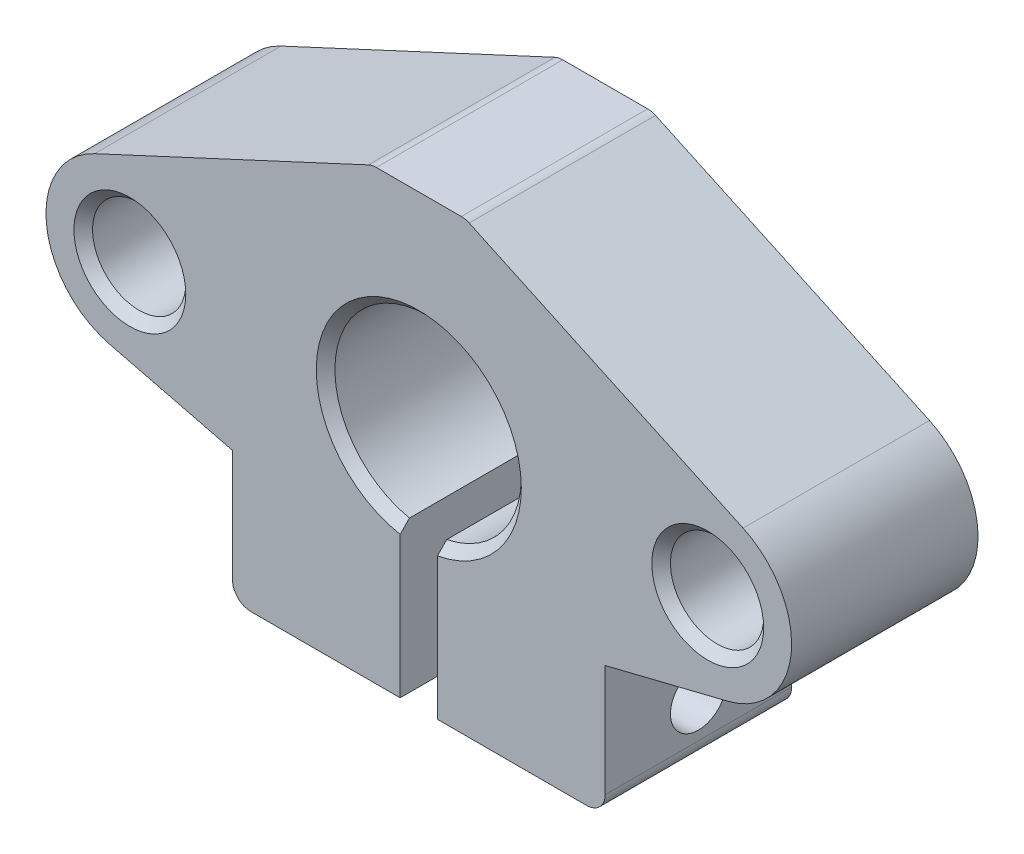
ISO-10303-21;
HEADER;
FILE_DESCRIPTION(('STEP AP214'),'2;1');
FILE_NAME('part.step','',(''),(''),'','','');
FILE_SCHEMA(('AUTOMOTIVE_DESIGN { 1 0 10303 214 1 1 1 1 }'));
ENDSEC;
DATA;
#1=APPLICATION_CONTEXT('core data for automotive mechanical design processes');
#2=APPLICATION_PROTOCOL_DEFINITION('international standard','automotive_design',2000,#1);
#3=PRODUCT_CONTEXT('',#1,'mechanical');
#4=PRODUCT('Part','Part','',(#3));
#5=PRODUCT_RELATED_PRODUCT_CATEGORY('part','',(#4));
#6=PRODUCT_DEFINITION_FORMATION('','',#4);
#7=PRODUCT_DEFINITION_CONTEXT('part definition',#1,'design');
#8=PRODUCT_DEFINITION('design','',#6,#7);
#9=PRODUCT_DEFINITION_SHAPE('','',#8);
#10=(LENGTH_UNIT() NAMED_UNIT(*) SI_UNIT(.MILLI.,.METRE.));
#11=(NAMED_UNIT(*) PLANE_ANGLE_UNIT() SI_UNIT($,.RADIAN.));
#12=(NAMED_UNIT(*) SI_UNIT($,.STERADIAN.) SOLID_ANGLE_UNIT());
#13=UNCERTAINTY_MEASURE_WITH_UNIT(LENGTH_MEASURE(1.E-05),#10,'distance_accuracy_value','');
#14=(GEOMETRIC_REPRESENTATION_CONTEXT(3) GLOBAL_UNCERTAINTY_ASSIGNED_CONTEXT((#13)) GLOBAL_UNIT_ASSIGNED_CONTEXT((#10,
#11,#12)) REPRESENTATION_CONTEXT('',''));
#15=CARTESIAN_POINT('',(0.,0.,0.));
#16=DIRECTION('',(0.,0.,1.));
#17=DIRECTION('',(1.,0.,0.));
#18=AXIS2_PLACEMENT_3D('',#15,#16,#17);
#19=CARTESIAN_POINT('',(-10.,0.,10.));
#20=DIRECTION('',(0.,1.,0.));
#21=DIRECTION('',(0.,0.,1.));
#22=AXIS2_PLACEMENT_3D('',#19,#20,#21);
#23=PLANE('',#22);
#24=DIRECTION('',(1.,0.,0.));
#25=VECTOR('',#24,1.);
#26=CARTESIAN_POINT('',(-10.,0.,10.));
#27=LINE('',#26,#25);
#28=CARTESIAN_POINT('',(-9.,0.,10.));
#29=VERTEX_POINT('',#28);
#30=CARTESIAN_POINT('',(-1.,0.,10.));
#31=VERTEX_POINT('',#30);
#32=EDGE_CURVE('E254',#29,#31,#27,.T.);
#33=ORIENTED_EDGE('',*,*,#32,.F.);
#34=DIRECTION('',(0.,0.,-1.));
#35=VECTOR('',#34,1.);
#36=CARTESIAN_POINT('',(-9.,0.,10.));
#37=LINE('',#36,#35);
#38=CARTESIAN_POINT('',(-9.,0.,0.));
#39=VERTEX_POINT('',#38);
#40=EDGE_CURVE('E195',#29,#39,#37,.T.);
#41=ORIENTED_EDGE('',*,*,#40,.T.);
#42=DIRECTION('',(1.,0.,0.));
#43=VECTOR('',#42,1.);
#44=CARTESIAN_POINT('',(-10.,0.,0.));
#45=LINE('',#44,#43);
#46=CARTESIAN_POINT('',(-1.,0.,0.));
#47=VERTEX_POINT('',#46);
#48=EDGE_CURVE('E190',#39,#47,#45,.T.);
#49=ORIENTED_EDGE('',*,*,#48,.T.);
#50=DIRECTION('',(0.,0.,-1.));
#51=VECTOR('',#50,1.);
#52=CARTESIAN_POINT('',(-1.,0.,10.));
#53=LINE('',#52,#51);
#54=EDGE_CURVE('E186',#31,#47,#53,.T.);
#55=ORIENTED_EDGE('',*,*,#54,.F.);
#56=EDGE_LOOP('',(#33,#41,#49,#55));
#57=FACE_BOUND('',#56,.T.);
#58=ADVANCED_FACE('F44',(#57),#23,.F.);
#59=CARTESIAN_POINT('',(1.,0.,0.));
#60=VERTEX_POINT('',#59);
#61=CARTESIAN_POINT('',(9.,0.,0.));
#62=VERTEX_POINT('',#61);
#63=EDGE_CURVE('E192',#60,#62,#45,.T.);
#64=ORIENTED_EDGE('',*,*,#63,.T.);
#65=DIRECTION('',(0.,0.,-1.));
#66=VECTOR('',#65,1.);
#67=CARTESIAN_POINT('',(9.,0.,10.));
#68=LINE('',#67,#66);
#69=CARTESIAN_POINT('',(9.,0.,10.));
#70=VERTEX_POINT('',#69);
#71=EDGE_CURVE('E11',#62,#70,#68,.F.);
#72=ORIENTED_EDGE('',*,*,#71,.T.);
#73=CARTESIAN_POINT('',(0.999999999999999,0.,10.));
#74=VERTEX_POINT('',#73);
#75=EDGE_CURVE('E256',#74,#70,#27,.T.);
#76=ORIENTED_EDGE('',*,*,#75,.F.);
#77=DIRECTION('',(0.,0.,1.));
#78=VECTOR('',#77,1.);
#79=CARTESIAN_POINT('',(0.999999999999999,0.,10.));
#80=LINE('',#79,#78);
#81=EDGE_CURVE('E210',#60,#74,#80,.T.);
#82=ORIENTED_EDGE('',*,*,#81,.F.);
#83=EDGE_LOOP('',(#64,#72,#76,#82));
#84=FACE_BOUND('',#83,.T.);
#85=ADVANCED_FACE('F409',(#84),#23,.F.);
#86=CARTESIAN_POINT('',(0.,13.,10.));
#87=DIRECTION('',(0.,0.,1.));
#88=DIRECTION('',(1.,0.,0.));
#89=AXIS2_PLACEMENT_3D('',#86,#87,#88);
#90=PLANE('',#89);
#91=CARTESIAN_POINT('',(15.5,13.,10.));
#92=DIRECTION('',(0.,0.,1.));
#93=DIRECTION('',(1.,0.,0.));
#94=AXIS2_PLACEMENT_3D('',#91,#92,#93);
#95=CIRCLE('',#94,3.00000000000001);
#96=CARTESIAN_POINT('',(18.5,13.,10.));
#97=VERTEX_POINT('',#96);
#98=EDGE_CURVE('E503',#97,#97,#95,.F.);
#99=ORIENTED_EDGE('',*,*,#98,.T.);
#100=EDGE_LOOP('',(#99));
#101=FACE_BOUND('',#100,.T.);
#102=CARTESIAN_POINT('',(-15.5,13.,10.));
#103=DIRECTION('',(0.,0.,1.));
#104=DIRECTION('',(1.,0.,0.));
#105=AXIS2_PLACEMENT_3D('',#102,#103,#104);
#106=CIRCLE('',#105,3.);
#107=CARTESIAN_POINT('',(-12.5,13.,10.));
#108=VERTEX_POINT('',#107);
#109=EDGE_CURVE('E508',#108,#108,#106,.F.);
#110=ORIENTED_EDGE('',*,*,#109,.T.);
#111=EDGE_LOOP('',(#110));
#112=FACE_BOUND('',#111,.T.);
#113=DIRECTION('',(-1.,0.,0.));
#114=VECTOR('',#113,1.);
#115=CARTESIAN_POINT('',(0.,24.,10.));
#116=LINE('',#115,#114);
#117=CARTESIAN_POINT('',(2.27909240608666,24.,10.));
#118=VERTEX_POINT('',#117);
#119=CARTESIAN_POINT('',(-2.27909240608666,24.,10.));
#120=VERTEX_POINT('',#119);
#121=EDGE_CURVE('E260',#118,#120,#116,.T.);
#122=ORIENTED_EDGE('',*,*,#121,.T.);
#123=CARTESIAN_POINT('',(-2.27909240608666,23.,10.));
#124=DIRECTION('',(0.,0.,1.));
#125=DIRECTION('',(1.,0.,0.));
#126=AXIS2_PLACEMENT_3D('',#123,#124,#125);
#127=CIRCLE('',#126,1.);
#128=CARTESIAN_POINT('',(-2.70035014664606,23.9069409661157,10.));
#129=VERTEX_POINT('',#128);
#130=EDGE_CURVE('E480',#120,#129,#127,.T.);
#131=ORIENTED_EDGE('',*,*,#130,.T.);
#132=DIRECTION('',(-0.906940966115651,-0.421257740559398,0.));
#133=VECTOR('',#132,1.);
#134=CARTESIAN_POINT('',(-2.5,24.,10.));
#135=LINE('',#134,#133);
#136=CARTESIAN_POINT('',(-17.3956598325173,17.0812343475204,10.));
#137=VERTEX_POINT('',#136);
#138=EDGE_CURVE('E261',#129,#137,#135,.T.);
#139=ORIENTED_EDGE('',*,*,#138,.T.);
#140=CARTESIAN_POINT('',(-15.5,13.,10.));
#141=DIRECTION('',(0.,0.,1.));
#142=DIRECTION('',(1.,0.,0.));
#143=AXIS2_PLACEMENT_3D('',#140,#141,#142);
#144=CIRCLE('',#143,4.5);
#145=CARTESIAN_POINT('',(-16.5829873138775,8.63226162894565,10.));
#146=VERTEX_POINT('',#145);
#147=EDGE_CURVE('E263',#137,#146,#144,.T.);
#148=ORIENTED_EDGE('',*,*,#147,.T.);
#149=DIRECTION('',(0.970608526900966,-0.240663847528326,0.));
#150=VECTOR('',#149,1.);
#151=CARTESIAN_POINT('',(-16.5829873138775,8.63226162894565,10.));
#152=LINE('',#151,#150);
#153=CARTESIAN_POINT('',(-10.,7.,10.));
#154=VERTEX_POINT('',#153);
#155=EDGE_CURVE('E264',#146,#154,#152,.T.);
#156=ORIENTED_EDGE('',*,*,#155,.T.);
#157=DIRECTION('',(0.,-1.,0.));
#158=VECTOR('',#157,1.);
#159=CARTESIAN_POINT('',(-10.,7.,10.));
#160=LINE('',#159,#158);
#161=CARTESIAN_POINT('',(-10.,1.,10.));
#162=VERTEX_POINT('',#161);
#163=EDGE_CURVE('E270',#154,#162,#160,.T.);
#164=ORIENTED_EDGE('',*,*,#163,.T.);
#165=CARTESIAN_POINT('',(-9.,1.,10.));
#166=DIRECTION('',(0.,0.,1.));
#167=DIRECTION('',(1.,0.,0.));
#168=AXIS2_PLACEMENT_3D('',#165,#166,#167);
#169=CIRCLE('',#168,1.);
#170=EDGE_CURVE('E70',#162,#29,#169,.T.);
#171=ORIENTED_EDGE('',*,*,#170,.T.);
#172=ORIENTED_EDGE('',*,*,#32,.T.);
#173=DIRECTION('',(0.,-1.,0.));
#174=VECTOR('',#173,1.);
#175=CARTESIAN_POINT('',(-1.,10.,10.));
#176=LINE('',#175,#174);
#177=CARTESIAN_POINT('',(-1.,7.59167308680401,10.));
#178=VERTEX_POINT('',#177);
#179=EDGE_CURVE('E215',#178,#31,#176,.T.);
#180=ORIENTED_EDGE('',*,*,#179,.F.);
#181=CARTESIAN_POINT('',(0.,13.,10.));
#182=DIRECTION('',(0.,0.,1.));
#183=DIRECTION('',(1.,0.,0.));
#184=AXIS2_PLACEMENT_3D('',#181,#182,#183);
#185=CIRCLE('',#184,5.50000000000001);
#186=CARTESIAN_POINT('',(0.999999999999999,7.59167308680401,10.));
#187=VERTEX_POINT('',#186);
#188=EDGE_CURVE('E509',#178,#187,#185,.F.);
#189=ORIENTED_EDGE('',*,*,#188,.T.);
#190=DIRECTION('',(0.,-1.,0.));
#191=VECTOR('',#190,1.);
#192=CARTESIAN_POINT('',(0.999999999999999,10.,10.));
#193=LINE('',#192,#191);
#194=EDGE_CURVE('E221',#187,#74,#193,.T.);
#195=ORIENTED_EDGE('',*,*,#194,.T.);
#196=ORIENTED_EDGE('',*,*,#75,.T.);
#197=CARTESIAN_POINT('',(9.,1.,10.));
#198=DIRECTION('',(0.,0.,1.));
#199=DIRECTION('',(1.,0.,0.));
#200=AXIS2_PLACEMENT_3D('',#197,#198,#199);
#201=CIRCLE('',#200,1.);
#202=CARTESIAN_POINT('',(10.,1.,10.));
#203=VERTEX_POINT('',#202);
#204=EDGE_CURVE('E461',#70,#203,#201,.T.);
#205=ORIENTED_EDGE('',*,*,#204,.T.);
#206=DIRECTION('',(0.,-1.,0.));
#207=VECTOR('',#206,1.);
#208=CARTESIAN_POINT('',(10.,7.,10.));
#209=LINE('',#208,#207);
#210=CARTESIAN_POINT('',(10.,7.,10.));
#211=VERTEX_POINT('',#210);
#212=EDGE_CURVE('E230',#211,#203,#209,.T.);
#213=ORIENTED_EDGE('',*,*,#212,.F.);
#214=DIRECTION('',(-0.970608526900966,-0.240663847528326,0.));
#215=VECTOR('',#214,1.);
#216=CARTESIAN_POINT('',(16.5829873138775,8.63226162894565,10.));
#217=LINE('',#216,#215);
#218=CARTESIAN_POINT('',(16.5829873138775,8.63226162894565,10.));
#219=VERTEX_POINT('',#218);
#220=EDGE_CURVE('E226',#219,#211,#217,.T.);
#221=ORIENTED_EDGE('',*,*,#220,.F.);
#222=CARTESIAN_POINT('',(15.5,13.,10.));
#223=DIRECTION('',(0.,0.,-1.));
#224=DIRECTION('',(-1.,0.,0.));
#225=AXIS2_PLACEMENT_3D('',#222,#223,#224);
#226=CIRCLE('',#225,4.5);
#227=CARTESIAN_POINT('',(17.3956598325173,17.0812343475204,10.));
#228=VERTEX_POINT('',#227);
#229=EDGE_CURVE('E234',#228,#219,#226,.T.);
#230=ORIENTED_EDGE('',*,*,#229,.F.);
#231=DIRECTION('',(0.906940966115651,-0.421257740559398,0.));
#232=VECTOR('',#231,1.);
#233=CARTESIAN_POINT('',(2.5,24.,10.));
#234=LINE('',#233,#232);
#235=CARTESIAN_POINT('',(2.70035014664606,23.9069409661157,10.));
#236=VERTEX_POINT('',#235);
#237=EDGE_CURVE('E240',#236,#228,#234,.T.);
#238=ORIENTED_EDGE('',*,*,#237,.F.);
#239=CARTESIAN_POINT('',(2.27909240608666,23.,10.));
#240=DIRECTION('',(0.,0.,1.));
#241=DIRECTION('',(1.,0.,0.));
#242=AXIS2_PLACEMENT_3D('',#239,#240,#241);
#243=CIRCLE('',#242,1.);
#244=EDGE_CURVE('E467',#236,#118,#243,.T.);
#245=ORIENTED_EDGE('',*,*,#244,.T.);
#246=EDGE_LOOP('',(#122,#131,#139,#148,#156,#164,#171,#172,#180,#189,#195,#196,#205,#213,#221,
#230,#238,#245));
#247=FACE_BOUND('',#246,.T.);
#248=ADVANCED_FACE('F414',(#101,#112,#247),#90,.T.);
#249=CARTESIAN_POINT('',(0.,13.,0.));
#250=DIRECTION('',(0.,0.,1.));
#251=DIRECTION('',(1.,0.,0.));
#252=AXIS2_PLACEMENT_3D('',#249,#250,#251);
#253=PLANE('',#252);
#254=CARTESIAN_POINT('',(15.5,13.,0.));
#255=DIRECTION('',(0.,0.,1.));
#256=DIRECTION('',(1.,0.,0.));
#257=AXIS2_PLACEMENT_3D('',#254,#255,#256);
#258=CIRCLE('',#257,3.);
#259=CARTESIAN_POINT('',(18.5,13.,0.));
#260=VERTEX_POINT('',#259);
#261=EDGE_CURVE('E315',#260,#260,#258,.T.);
#262=ORIENTED_EDGE('',*,*,#261,.T.);
#263=EDGE_LOOP('',(#262));
#264=FACE_BOUND('',#263,.T.);
#265=CARTESIAN_POINT('',(-15.5,13.,0.));
#266=DIRECTION('',(0.,0.,1.));
#267=DIRECTION('',(1.,0.,0.));
#268=AXIS2_PLACEMENT_3D('',#265,#266,#267);
#269=CIRCLE('',#268,3.);
#270=CARTESIAN_POINT('',(-12.5,13.,0.));
#271=VERTEX_POINT('',#270);
#272=EDGE_CURVE('E306',#271,#271,#269,.T.);
#273=ORIENTED_EDGE('',*,*,#272,.T.);
#274=EDGE_LOOP('',(#273));
#275=FACE_BOUND('',#274,.T.);
#276=DIRECTION('',(-0.906940966115651,-0.421257740559398,0.));
#277=VECTOR('',#276,1.);
#278=CARTESIAN_POINT('',(-2.5,24.,0.));
#279=LINE('',#278,#277);
#280=CARTESIAN_POINT('',(-2.70035014664606,23.9069409661157,0.));
#281=VERTEX_POINT('',#280);
#282=CARTESIAN_POINT('',(-17.3956598325173,17.0812343475204,0.));
#283=VERTEX_POINT('',#282);
#284=EDGE_CURVE('E275',#281,#283,#279,.T.);
#285=ORIENTED_EDGE('',*,*,#284,.F.);
#286=CARTESIAN_POINT('',(-2.27909240608666,23.,0.));
#287=DIRECTION('',(0.,0.,1.));
#288=DIRECTION('',(1.,0.,0.));
#289=AXIS2_PLACEMENT_3D('',#286,#287,#288);
#290=CIRCLE('',#289,1.);
#291=CARTESIAN_POINT('',(-2.27909240608666,24.,0.));
#292=VERTEX_POINT('',#291);
#293=EDGE_CURVE('E492',#281,#292,#290,.F.);
#294=ORIENTED_EDGE('',*,*,#293,.T.);
#295=DIRECTION('',(-1.,0.,0.));
#296=VECTOR('',#295,1.);
#297=CARTESIAN_POINT('',(0.,24.,0.));
#298=LINE('',#297,#296);
#299=CARTESIAN_POINT('',(2.27909240608666,24.,0.));
#300=VERTEX_POINT('',#299);
#301=EDGE_CURVE('E194',#300,#292,#298,.T.);
#302=ORIENTED_EDGE('',*,*,#301,.F.);
#303=CARTESIAN_POINT('',(2.27909240608666,23.,0.));
#304=DIRECTION('',(0.,0.,1.));
#305=DIRECTION('',(1.,0.,0.));
#306=AXIS2_PLACEMENT_3D('',#303,#304,#305);
#307=CIRCLE('',#306,1.);
#308=CARTESIAN_POINT('',(2.70035014664606,23.9069409661157,0.));
#309=VERTEX_POINT('',#308);
#310=EDGE_CURVE('E489',#300,#309,#307,.F.);
#311=ORIENTED_EDGE('',*,*,#310,.T.);
#312=DIRECTION('',(0.906940966115651,-0.421257740559398,0.));
#313=VECTOR('',#312,1.);
#314=CARTESIAN_POINT('',(2.5,24.,0.));
#315=LINE('',#314,#313);
#316=CARTESIAN_POINT('',(17.3956598325173,17.0812343475204,0.));
#317=VERTEX_POINT('',#316);
#318=EDGE_CURVE('E233',#309,#317,#315,.T.);
#319=ORIENTED_EDGE('',*,*,#318,.T.);
#320=CARTESIAN_POINT('',(15.5,13.,0.));
#321=DIRECTION('',(0.,0.,-1.));
#322=DIRECTION('',(-1.,0.,0.));
#323=AXIS2_PLACEMENT_3D('',#320,#321,#322);
#324=CIRCLE('',#323,4.5);
#325=CARTESIAN_POINT('',(16.5829873138775,8.63226162894565,0.));
#326=VERTEX_POINT('',#325);
#327=EDGE_CURVE('E241',#317,#326,#324,.T.);
#328=ORIENTED_EDGE('',*,*,#327,.T.);
#329=DIRECTION('',(-0.970608526900966,-0.240663847528326,0.));
#330=VECTOR('',#329,1.);
#331=CARTESIAN_POINT('',(16.5829873138775,8.63226162894565,0.));
#332=LINE('',#331,#330);
#333=CARTESIAN_POINT('',(10.,7.,0.));
#334=VERTEX_POINT('',#333);
#335=EDGE_CURVE('E245',#326,#334,#332,.T.);
#336=ORIENTED_EDGE('',*,*,#335,.T.);
#337=DIRECTION('',(0.,-1.,0.));
#338=VECTOR('',#337,1.);
#339=CARTESIAN_POINT('',(10.,7.,0.));
#340=LINE('',#339,#338);
#341=CARTESIAN_POINT('',(10.,1.,0.));
#342=VERTEX_POINT('',#341);
#343=EDGE_CURVE('E224',#334,#342,#340,.T.);
#344=ORIENTED_EDGE('',*,*,#343,.T.);
#345=CARTESIAN_POINT('',(9.,1.,0.));
#346=DIRECTION('',(0.,0.,1.));
#347=DIRECTION('',(1.,0.,0.));
#348=AXIS2_PLACEMENT_3D('',#345,#346,#347);
#349=CIRCLE('',#348,1.);
#350=EDGE_CURVE('E457',#342,#62,#349,.F.);
#351=ORIENTED_EDGE('',*,*,#350,.T.);
#352=ORIENTED_EDGE('',*,*,#63,.F.);
#353=DIRECTION('',(0.,-1.,0.));
#354=VECTOR('',#353,1.);
#355=CARTESIAN_POINT('',(1.,10.,0.));
#356=LINE('',#355,#354);
#357=CARTESIAN_POINT('',(1.,7.591673086804,0.));
#358=VERTEX_POINT('',#357);
#359=EDGE_CURVE('E206',#358,#60,#356,.T.);
#360=ORIENTED_EDGE('',*,*,#359,.F.);
#361=CARTESIAN_POINT('',(0.,13.,0.));
#362=DIRECTION('',(0.,0.,1.));
#363=DIRECTION('',(1.,0.,0.));
#364=AXIS2_PLACEMENT_3D('',#361,#362,#363);
#365=CIRCLE('',#364,5.50000000000001);
#366=CARTESIAN_POINT('',(-1.,7.591673086804,0.));
#367=VERTEX_POINT('',#366);
#368=EDGE_CURVE('E201',#358,#367,#365,.T.);
#369=ORIENTED_EDGE('',*,*,#368,.T.);
#370=DIRECTION('',(0.,-1.,0.));
#371=VECTOR('',#370,1.);
#372=CARTESIAN_POINT('',(-1.,10.,0.));
#373=LINE('',#372,#371);
#374=EDGE_CURVE('E196',#367,#47,#373,.T.);
#375=ORIENTED_EDGE('',*,*,#374,.T.);
#376=ORIENTED_EDGE('',*,*,#48,.F.);
#377=CARTESIAN_POINT('',(-9.,1.,0.));
#378=DIRECTION('',(0.,0.,1.));
#379=DIRECTION('',(1.,0.,0.));
#380=AXIS2_PLACEMENT_3D('',#377,#378,#379);
#381=CIRCLE('',#380,1.);
#382=CARTESIAN_POINT('',(-10.,1.,0.));
#383=VERTEX_POINT('',#382);
#384=EDGE_CURVE('E500',#39,#383,#381,.F.);
#385=ORIENTED_EDGE('',*,*,#384,.T.);
#386=DIRECTION('',(0.,-1.,0.));
#387=VECTOR('',#386,1.);
#388=CARTESIAN_POINT('',(-10.,7.,0.));
#389=LINE('',#388,#387);
#390=CARTESIAN_POINT('',(-10.,7.,0.));
#391=VERTEX_POINT('',#390);
#392=EDGE_CURVE('E279',#391,#383,#389,.T.);
#393=ORIENTED_EDGE('',*,*,#392,.F.);
#394=DIRECTION('',(0.970608526900966,-0.240663847528326,0.));
#395=VECTOR('',#394,1.);
#396=CARTESIAN_POINT('',(-16.5829873138775,8.63226162894565,0.));
#397=LINE('',#396,#395);
#398=CARTESIAN_POINT('',(-16.5829873138775,8.63226162894565,0.));
#399=VERTEX_POINT('',#398);
#400=EDGE_CURVE('E277',#399,#391,#397,.T.);
#401=ORIENTED_EDGE('',*,*,#400,.F.);
#402=CARTESIAN_POINT('',(-15.5,13.,0.));
#403=DIRECTION('',(0.,0.,1.));
#404=DIRECTION('',(1.,0.,0.));
#405=AXIS2_PLACEMENT_3D('',#402,#403,#404);
#406=CIRCLE('',#405,4.5);
#407=EDGE_CURVE('E273',#283,#399,#406,.T.);
#408=ORIENTED_EDGE('',*,*,#407,.F.);
#409=EDGE_LOOP('',(#285,#294,#302,#311,#319,#328,#336,#344,#351,#352,#360,#369,#375,#376,#385,
#393,#401,#408));
#410=FACE_BOUND('',#409,.T.);
#411=ADVANCED_FACE('F199',(#264,#275,#410),#253,.F.);
#412=CARTESIAN_POINT('',(0.,13.,10.));
#413=DIRECTION('',(0.,0.,-1.));
#414=DIRECTION('',(-1.,0.,0.));
#415=AXIS2_PLACEMENT_3D('',#412,#413,#414);
#416=CYLINDRICAL_SURFACE('',#415,5.);
#417=DIRECTION('',(0.,0.,-1.));
#418=VECTOR('',#417,1.);
#419=CARTESIAN_POINT('',(-1.,8.10102051443364,10.));
#420=LINE('',#419,#418);
#421=CARTESIAN_POINT('',(-1.,8.10102051443364,9.49999999999999));
#422=VERTEX_POINT('',#421);
#423=CARTESIAN_POINT('',(-1.,8.10102051443364,0.500000000000013));
#424=VERTEX_POINT('',#423);
#425=EDGE_CURVE('E292',#422,#424,#420,.T.);
#426=ORIENTED_EDGE('',*,*,#425,.T.);
#427=CARTESIAN_POINT('',(0.,13.,0.500000000000013));
#428=DIRECTION('',(0.,0.,1.));
#429=DIRECTION('',(1.,0.,0.));
#430=AXIS2_PLACEMENT_3D('',#427,#428,#429);
#431=CIRCLE('',#430,5.);
#432=CARTESIAN_POINT('',(0.999999999999999,8.10102051443364,0.500000000000013));
#433=VERTEX_POINT('',#432);
#434=EDGE_CURVE('E320',#424,#433,#431,.F.);
#435=ORIENTED_EDGE('',*,*,#434,.T.);
#436=DIRECTION('',(0.,0.,-1.));
#437=VECTOR('',#436,1.);
#438=CARTESIAN_POINT('',(0.999999999999999,8.10102051443364,10.));
#439=LINE('',#438,#437);
#440=CARTESIAN_POINT('',(0.999999999999999,8.10102051443364,9.49999999999999));
#441=VERTEX_POINT('',#440);
#442=EDGE_CURVE('E286',#433,#441,#439,.F.);
#443=ORIENTED_EDGE('',*,*,#442,.T.);
#444=CARTESIAN_POINT('',(0.,13.,9.49999999999999));
#445=DIRECTION('',(0.,0.,1.));
#446=DIRECTION('',(1.,0.,0.));
#447=AXIS2_PLACEMENT_3D('',#444,#445,#446);
#448=CIRCLE('',#447,5.);
#449=EDGE_CURVE('E312',#441,#422,#448,.T.);
#450=ORIENTED_EDGE('',*,*,#449,.T.);
#451=EDGE_LOOP('',(#426,#435,#443,#450));
#452=FACE_BOUND('',#451,.T.);
#453=ADVANCED_FACE('F417',(#452),#416,.F.);
#454=CARTESIAN_POINT('',(0.,24.,10.));
#455=DIRECTION('',(0.,-1.,0.));
#456=DIRECTION('',(0.,0.,-1.));
#457=AXIS2_PLACEMENT_3D('',#454,#455,#456);
#458=PLANE('',#457);
#459=ORIENTED_EDGE('',*,*,#301,.T.);
#460=DIRECTION('',(0.,0.,-1.));
#461=VECTOR('',#460,1.);
#462=CARTESIAN_POINT('',(-2.27909240608666,24.,10.));
#463=LINE('',#462,#461);
#464=EDGE_CURVE('E466',#292,#120,#463,.F.);
#465=ORIENTED_EDGE('',*,*,#464,.T.);
#466=ORIENTED_EDGE('',*,*,#121,.F.);
#467=DIRECTION('',(0.,0.,-1.));
#468=VECTOR('',#467,1.);
#469=CARTESIAN_POINT('',(2.27909240608666,24.,0.));
#470=LINE('',#469,#468);
#471=EDGE_CURVE('E472',#118,#300,#470,.T.);
#472=ORIENTED_EDGE('',*,*,#471,.T.);
#473=EDGE_LOOP('',(#459,#465,#466,#472));
#474=FACE_BOUND('',#473,.T.);
#475=ADVANCED_FACE('F548',(#474),#458,.F.);
#476=CARTESIAN_POINT('',(-2.5,24.,10.));
#477=DIRECTION('',(0.421257740559398,-0.906940966115652,0.));
#478=DIRECTION('',(0.906940966115652,0.421257740559398,0.));
#479=AXIS2_PLACEMENT_3D('',#476,#477,#478);
#480=PLANE('',#479);
#481=ORIENTED_EDGE('',*,*,#138,.F.);
#482=DIRECTION('',(0.,0.,-1.));
#483=VECTOR('',#482,1.);
#484=CARTESIAN_POINT('',(-2.70035014664606,23.9069409661157,10.));
#485=LINE('',#484,#483);
#486=EDGE_CURVE('E498',#129,#281,#485,.T.);
#487=ORIENTED_EDGE('',*,*,#486,.T.);
#488=ORIENTED_EDGE('',*,*,#284,.T.);
#489=DIRECTION('',(0.,0.,-1.));
#490=VECTOR('',#489,1.);
#491=CARTESIAN_POINT('',(-17.3956598325173,17.0812343475204,10.));
#492=LINE('',#491,#490);
#493=EDGE_CURVE('E281',#137,#283,#492,.T.);
#494=ORIENTED_EDGE('',*,*,#493,.F.);
#495=EDGE_LOOP('',(#481,#487,#488,#494));
#496=FACE_BOUND('',#495,.T.);
#497=ADVANCED_FACE('F546',(#496),#480,.F.);
#498=CARTESIAN_POINT('',(-15.5,13.,10.));
#499=DIRECTION('',(0.,0.,-1.));
#500=DIRECTION('',(-1.,0.,0.));
#501=AXIS2_PLACEMENT_3D('',#498,#499,#500);
#502=CYLINDRICAL_SURFACE('',#501,4.5);
#503=ORIENTED_EDGE('',*,*,#407,.T.);
#504=DIRECTION('',(0.,0.,-1.));
#505=VECTOR('',#504,1.);
#506=CARTESIAN_POINT('',(-16.5829873138775,8.63226162894565,10.));
#507=LINE('',#506,#505);
#508=EDGE_CURVE('E285',#146,#399,#507,.T.);
#509=ORIENTED_EDGE('',*,*,#508,.F.);
#510=ORIENTED_EDGE('',*,*,#147,.F.);
#511=ORIENTED_EDGE('',*,*,#493,.T.);
#512=EDGE_LOOP('',(#503,#509,#510,#511));
#513=FACE_BOUND('',#512,.T.);
#514=ADVANCED_FACE('F545',(#513),#502,.T.);
#515=CARTESIAN_POINT('',(-16.5829873138775,8.63226162894565,10.));
#516=DIRECTION('',(0.240663847528326,0.970608526900966,0.));
#517=DIRECTION('',(-0.970608526900966,0.240663847528326,0.));
#518=AXIS2_PLACEMENT_3D('',#515,#516,#517);
#519=PLANE('',#518);
#520=ORIENTED_EDGE('',*,*,#400,.T.);
#521=DIRECTION('',(0.,0.,-1.));
#522=VECTOR('',#521,1.);
#523=CARTESIAN_POINT('',(-10.,7.,10.));
#524=LINE('',#523,#522);
#525=EDGE_CURVE('E268',#154,#391,#524,.T.);
#526=ORIENTED_EDGE('',*,*,#525,.F.);
#527=ORIENTED_EDGE('',*,*,#155,.F.);
#528=ORIENTED_EDGE('',*,*,#508,.T.);
#529=EDGE_LOOP('',(#520,#526,#527,#528));
#530=FACE_BOUND('',#529,.T.);
#531=ADVANCED_FACE('F529',(#530),#519,.F.);
#532=CARTESIAN_POINT('',(-10.,7.,10.));
#533=DIRECTION('',(1.,0.,0.));
#534=DIRECTION('',(0.,0.,-1.));
#535=AXIS2_PLACEMENT_3D('',#532,#533,#534);
#536=PLANE('',#535);
#537=ORIENTED_EDGE('',*,*,#392,.T.);
#538=DIRECTION('',(0.,0.,-1.));
#539=VECTOR('',#538,1.);
#540=CARTESIAN_POINT('',(-10.,1.,10.));
#541=LINE('',#540,#539);
#542=CARTESIAN_POINT('',(-10.,1.,5.));
#543=VERTEX_POINT('',#542);
#544=EDGE_CURVE('E58',#383,#543,#541,.F.);
#545=ORIENTED_EDGE('',*,*,#544,.T.);
#546=CARTESIAN_POINT('',(-10.,3.,5.));
#547=DIRECTION('',(1.,0.,0.));
#548=DIRECTION('',(0.,0.,-1.));
#549=AXIS2_PLACEMENT_3D('',#546,#547,#548);
#550=CIRCLE('',#549,2.00000000000001);
#551=EDGE_CURVE('E294',#543,#543,#550,.T.);
#552=ORIENTED_EDGE('',*,*,#551,.T.);
#553=DIRECTION('',(0.,0.,-1.));
#554=VECTOR('',#553,1.);
#555=CARTESIAN_POINT('',(-10.,1.,10.));
#556=LINE('',#555,#554);
#557=EDGE_CURVE('E438',#543,#162,#556,.F.);
#558=ORIENTED_EDGE('',*,*,#557,.T.);
#559=ORIENTED_EDGE('',*,*,#163,.F.);
#560=ORIENTED_EDGE('',*,*,#525,.T.);
#561=EDGE_LOOP('',(#537,#545,#552,#558,#559,#560));
#562=FACE_BOUND('',#561,.T.);
#563=ADVANCED_FACE('F516',(#562),#536,.F.);
#564=CARTESIAN_POINT('',(-15.5,13.,10.));
#565=DIRECTION('',(0.,0.,-1.));
#566=DIRECTION('',(-1.,0.,0.));
#567=AXIS2_PLACEMENT_3D('',#564,#565,#566);
#568=CYLINDRICAL_SURFACE('',#567,2.5);
#569=CARTESIAN_POINT('',(-15.5,13.,0.500000000000011));
#570=DIRECTION('',(0.,0.,1.));
#571=DIRECTION('',(1.,0.,0.));
#572=AXIS2_PLACEMENT_3D('',#569,#570,#571);
#573=CIRCLE('',#572,2.5);
#574=CARTESIAN_POINT('',(-13.,13.,0.500000000000011));
#575=VERTEX_POINT('',#574);
#576=EDGE_CURVE('E512',#575,#575,#573,.F.);
#577=ORIENTED_EDGE('',*,*,#576,.T.);
#578=EDGE_LOOP('',(#577));
#579=FACE_BOUND('',#578,.T.);
#580=CARTESIAN_POINT('',(-15.5,13.,9.5));
#581=DIRECTION('',(0.,0.,1.));
#582=DIRECTION('',(1.,0.,0.));
#583=AXIS2_PLACEMENT_3D('',#580,#581,#582);
#584=CIRCLE('',#583,2.5);
#585=CARTESIAN_POINT('',(-13.,13.,9.5));
#586=VERTEX_POINT('',#585);
#587=EDGE_CURVE('E370',#586,#586,#584,.T.);
#588=ORIENTED_EDGE('',*,*,#587,.T.);
#589=EDGE_LOOP('',(#588));
#590=FACE_BOUND('',#589,.T.);
#591=ADVANCED_FACE('F518',(#579,#590),#568,.F.);
#592=CARTESIAN_POINT('',(10.,7.,10.));
#593=DIRECTION('',(1.,0.,0.));
#594=DIRECTION('',(0.,0.,-1.));
#595=AXIS2_PLACEMENT_3D('',#592,#593,#594);
#596=PLANE('',#595);
#597=CARTESIAN_POINT('',(10.,3.,5.));
#598=DIRECTION('',(1.,0.,0.));
#599=DIRECTION('',(0.,0.,-1.));
#600=AXIS2_PLACEMENT_3D('',#597,#598,#599);
#601=CIRCLE('',#600,1.5);
#602=CARTESIAN_POINT('',(10.,3.,3.5));
#603=VERTEX_POINT('',#602);
#604=EDGE_CURVE('E300',#603,#603,#601,.T.);
#605=ORIENTED_EDGE('',*,*,#604,.F.);
#606=EDGE_LOOP('',(#605));
#607=FACE_BOUND('',#606,.T.);
#608=ORIENTED_EDGE('',*,*,#212,.T.);
#609=DIRECTION('',(0.,0.,-1.));
#610=VECTOR('',#609,1.);
#611=CARTESIAN_POINT('',(10.,1.,0.));
#612=LINE('',#611,#610);
#613=EDGE_CURVE('E52',#203,#342,#612,.T.);
#614=ORIENTED_EDGE('',*,*,#613,.T.);
#615=ORIENTED_EDGE('',*,*,#343,.F.);
#616=DIRECTION('',(0.,0.,-1.));
#617=VECTOR('',#616,1.);
#618=CARTESIAN_POINT('',(10.,7.,10.));
#619=LINE('',#618,#617);
#620=EDGE_CURVE('E251',#211,#334,#619,.T.);
#621=ORIENTED_EDGE('',*,*,#620,.F.);
#622=EDGE_LOOP('',(#608,#614,#615,#621));
#623=FACE_BOUND('',#622,.T.);
#624=ADVANCED_FACE('F453',(#607,#623),#596,.T.);
#625=CARTESIAN_POINT('',(16.5829873138775,8.63226162894565,10.));
#626=DIRECTION('',(0.240663847528326,-0.970608526900966,0.));
#627=DIRECTION('',(0.970608526900966,0.240663847528326,0.));
#628=AXIS2_PLACEMENT_3D('',#625,#626,#627);
#629=PLANE('',#628);
#630=ORIENTED_EDGE('',*,*,#335,.F.);
#631=DIRECTION('',(0.,0.,-1.));
#632=VECTOR('',#631,1.);
#633=CARTESIAN_POINT('',(16.5829873138775,8.63226162894565,10.));
#634=LINE('',#633,#632);
#635=EDGE_CURVE('E253',#219,#326,#634,.T.);
#636=ORIENTED_EDGE('',*,*,#635,.F.);
#637=ORIENTED_EDGE('',*,*,#220,.T.);
#638=ORIENTED_EDGE('',*,*,#620,.T.);
#639=EDGE_LOOP('',(#630,#636,#637,#638));
#640=FACE_BOUND('',#639,.T.);
#641=ADVANCED_FACE('F462',(#640),#629,.T.);
#642=CARTESIAN_POINT('',(15.5,13.,10.));
#643=DIRECTION('',(0.,0.,-1.));
#644=DIRECTION('',(-1.,0.,0.));
#645=AXIS2_PLACEMENT_3D('',#642,#643,#644);
#646=CYLINDRICAL_SURFACE('',#645,4.5);
#647=ORIENTED_EDGE('',*,*,#327,.F.);
#648=DIRECTION('',(0.,0.,-1.));
#649=VECTOR('',#648,1.);
#650=CARTESIAN_POINT('',(17.3956598325173,17.0812343475204,10.));
#651=LINE('',#650,#649);
#652=EDGE_CURVE('E239',#228,#317,#651,.T.);
#653=ORIENTED_EDGE('',*,*,#652,.F.);
#654=ORIENTED_EDGE('',*,*,#229,.T.);
#655=ORIENTED_EDGE('',*,*,#635,.T.);
#656=EDGE_LOOP('',(#647,#653,#654,#655));
#657=FACE_BOUND('',#656,.T.);
#658=ADVANCED_FACE('F692',(#657),#646,.T.);
#659=CARTESIAN_POINT('',(2.5,24.,10.));
#660=DIRECTION('',(0.421257740559398,0.906940966115652,0.));
#661=DIRECTION('',(-0.906940966115652,0.421257740559398,0.));
#662=AXIS2_PLACEMENT_3D('',#659,#660,#661);
#663=PLANE('',#662);
#664=ORIENTED_EDGE('',*,*,#318,.F.);
#665=DIRECTION('',(0.,0.,-1.));
#666=VECTOR('',#665,1.);
#667=CARTESIAN_POINT('',(2.70035014664606,23.9069409661157,10.));
#668=LINE('',#667,#666);
#669=EDGE_CURVE('E441',#309,#236,#668,.F.);
#670=ORIENTED_EDGE('',*,*,#669,.T.);
#671=ORIENTED_EDGE('',*,*,#237,.T.);
#672=ORIENTED_EDGE('',*,*,#652,.T.);
#673=EDGE_LOOP('',(#664,#670,#671,#672));
#674=FACE_BOUND('',#673,.T.);
#675=ADVANCED_FACE('F485',(#674),#663,.T.);
#676=CARTESIAN_POINT('',(15.5,13.,10.));
#677=DIRECTION('',(0.,0.,-1.));
#678=DIRECTION('',(-1.,0.,0.));
#679=AXIS2_PLACEMENT_3D('',#676,#677,#678);
#680=CYLINDRICAL_SURFACE('',#679,2.5);
#681=CARTESIAN_POINT('',(15.5,13.,0.500000000000004));
#682=DIRECTION('',(0.,0.,1.));
#683=DIRECTION('',(1.,0.,0.));
#684=AXIS2_PLACEMENT_3D('',#681,#682,#683);
#685=CIRCLE('',#684,2.5);
#686=CARTESIAN_POINT('',(18.,13.,0.500000000000004));
#687=VERTEX_POINT('',#686);
#688=EDGE_CURVE('E302',#687,#687,#685,.F.);
#689=ORIENTED_EDGE('',*,*,#688,.T.);
#690=EDGE_LOOP('',(#689));
#691=FACE_BOUND('',#690,.T.);
#692=CARTESIAN_POINT('',(15.5,13.,9.49999999999999));
#693=DIRECTION('',(0.,0.,1.));
#694=DIRECTION('',(1.,0.,0.));
#695=AXIS2_PLACEMENT_3D('',#692,#693,#694);
#696=CIRCLE('',#695,2.5);
#697=CARTESIAN_POINT('',(18.,13.,9.49999999999999));
#698=VERTEX_POINT('',#697);
#699=EDGE_CURVE('E305',#698,#698,#696,.T.);
#700=ORIENTED_EDGE('',*,*,#699,.T.);
#701=EDGE_LOOP('',(#700));
#702=FACE_BOUND('',#701,.T.);
#703=ADVANCED_FACE('F342',(#691,#702),#680,.F.);
#704=CARTESIAN_POINT('',(0.999999999999999,10.,10.));
#705=DIRECTION('',(1.,0.,0.));
#706=DIRECTION('',(0.,0.,-1.));
#707=AXIS2_PLACEMENT_3D('',#704,#705,#706);
#708=PLANE('',#707);
#709=CARTESIAN_POINT('',(0.999999999999997,3.,5.));
#710=DIRECTION('',(1.,0.,0.));
#711=DIRECTION('',(0.,0.,-1.));
#712=AXIS2_PLACEMENT_3D('',#709,#710,#711);
#713=CIRCLE('',#712,1.5);
#714=CARTESIAN_POINT('',(0.999999999999998,3.,3.5));
#715=VERTEX_POINT('',#714);
#716=EDGE_CURVE('E213',#715,#715,#713,.T.);
#717=ORIENTED_EDGE('',*,*,#716,.T.);
#718=EDGE_LOOP('',(#717));
#719=FACE_BOUND('',#718,.T.);
#720=ORIENTED_EDGE('',*,*,#442,.F.);
#721=CARTESIAN_POINT('',(0.999999999999999,8.10102051443364,0.500000000000013));
#722=CARTESIAN_POINT('',(0.999999999999999,8.01605440911086,0.41674293205438));
#723=CARTESIAN_POINT('',(1.,7.93112573707284,0.333447731014155));
#724=CARTESIAN_POINT('',(1.,7.76134326119773,0.166781064346018));
#725=CARTESIAN_POINT('',(1.,7.67648945735921,0.0834095987195723));
#726=CARTESIAN_POINT('',(1.,7.591673086804,0.));
#727=B_SPLINE_CURVE_WITH_KNOTS('',3,(#721,#722,#723,#724,#725,#726),.UNSPECIFIED.,.F.,.F.,(4,2,
4),(0.,0.356873547148378,0.713747087438369),.UNSPECIFIED.);
#728=EDGE_CURVE('E327',#433,#358,#727,.T.);
#729=ORIENTED_EDGE('',*,*,#728,.T.);
#730=ORIENTED_EDGE('',*,*,#359,.T.);
#731=ORIENTED_EDGE('',*,*,#81,.T.);
#732=ORIENTED_EDGE('',*,*,#194,.F.);
#733=CARTESIAN_POINT('',(0.999999999999999,7.59167308680401,10.));
#734=CARTESIAN_POINT('',(0.999999999999999,7.67648945735922,9.91659040128043));
#735=CARTESIAN_POINT('',(0.999999999999999,7.76134326119774,9.83321893565398));
#736=CARTESIAN_POINT('',(0.999999999999999,7.93112573707284,9.66655226898585));
#737=CARTESIAN_POINT('',(0.999999999999999,8.01605440911086,9.58325706794562));
#738=CARTESIAN_POINT('',(0.999999999999999,8.10102051443364,9.49999999999999));
#739=B_SPLINE_CURVE_WITH_KNOTS('',3,(#733,#734,#735,#736,#737,#738),.UNSPECIFIED.,.F.,.F.,(4,2,
4),(0.,0.356873540289986,0.713747087438359),.UNSPECIFIED.);
#740=EDGE_CURVE('E319',#187,#441,#739,.T.);
#741=ORIENTED_EDGE('',*,*,#740,.T.);
#742=EDGE_LOOP('',(#720,#729,#730,#731,#732,#741));
#743=FACE_BOUND('',#742,.T.);
#744=ADVANCED_FACE('F336',(#719,#743),#708,.F.);
#745=CARTESIAN_POINT('',(-1.,10.,10.));
#746=DIRECTION('',(-1.,0.,0.));
#747=DIRECTION('',(0.,0.,1.));
#748=AXIS2_PLACEMENT_3D('',#745,#746,#747);
#749=PLANE('',#748);
#750=CARTESIAN_POINT('',(-1.,3.,5.));
#751=DIRECTION('',(-1.,0.,0.));
#752=DIRECTION('',(0.,0.,1.));
#753=AXIS2_PLACEMENT_3D('',#750,#751,#752);
#754=CIRCLE('',#753,1.5);
#755=CARTESIAN_POINT('',(-1.,3.,6.5));
#756=VERTEX_POINT('',#755);
#757=EDGE_CURVE('E217',#756,#756,#754,.T.);
#758=ORIENTED_EDGE('',*,*,#757,.T.);
#759=EDGE_LOOP('',(#758));
#760=FACE_BOUND('',#759,.T.);
#761=ORIENTED_EDGE('',*,*,#374,.F.);
#762=CARTESIAN_POINT('',(-1.,7.591673086804,0.));
#763=CARTESIAN_POINT('',(-1.,7.67648945735921,0.0834095987195726));
#764=CARTESIAN_POINT('',(-1.,7.76134326119773,0.166781064346019));
#765=CARTESIAN_POINT('',(-1.,7.93112573707284,0.333447731014155));
#766=CARTESIAN_POINT('',(-1.,8.01605440911086,0.41674293205438));
#767=CARTESIAN_POINT('',(-1.,8.10102051443364,0.500000000000013));
#768=B_SPLINE_CURVE_WITH_KNOTS('',3,(#762,#763,#764,#765,#766,#767),.UNSPECIFIED.,.F.,.F.,(4,2,
4),(0.,0.356873540289991,0.713747087438368),.UNSPECIFIED.);
#769=EDGE_CURVE('E363',#367,#424,#768,.T.);
#770=ORIENTED_EDGE('',*,*,#769,.T.);
#771=ORIENTED_EDGE('',*,*,#425,.F.);
#772=CARTESIAN_POINT('',(-1.,8.10102051443364,9.49999999999999));
#773=CARTESIAN_POINT('',(-1.,8.01605440911086,9.58325706794562));
#774=CARTESIAN_POINT('',(-1.,7.93112573707284,9.66655226898585));
#775=CARTESIAN_POINT('',(-1.,7.76134326119774,9.83321893565398));
#776=CARTESIAN_POINT('',(-1.,7.67648945735922,9.91659040128043));
#777=CARTESIAN_POINT('',(-1.,7.59167308680401,10.));
#778=B_SPLINE_CURVE_WITH_KNOTS('',3,(#772,#773,#774,#775,#776,#777),.UNSPECIFIED.,.F.,.F.,(4,2,
4),(0.,0.356873547148373,0.71374708743836),.UNSPECIFIED.);
#779=EDGE_CURVE('E351',#422,#178,#778,.T.);
#780=ORIENTED_EDGE('',*,*,#779,.T.);
#781=ORIENTED_EDGE('',*,*,#179,.T.);
#782=ORIENTED_EDGE('',*,*,#54,.T.);
#783=EDGE_LOOP('',(#761,#770,#771,#780,#781,#782));
#784=FACE_BOUND('',#783,.T.);
#785=ADVANCED_FACE('F209',(#760,#784),#749,.F.);
#786=CARTESIAN_POINT('',(-20.,3.,5.));
#787=DIRECTION('',(1.,0.,0.));
#788=DIRECTION('',(0.,0.,-1.));
#789=AXIS2_PLACEMENT_3D('',#786,#787,#788);
#790=CYLINDRICAL_SURFACE('',#789,1.5);
#791=CARTESIAN_POINT('',(-9.49999999999999,3.,5.));
#792=DIRECTION('',(1.,0.,0.));
#793=DIRECTION('',(0.,0.,-1.));
#794=AXIS2_PLACEMENT_3D('',#791,#792,#793);
#795=CIRCLE('',#794,1.5);
#796=CARTESIAN_POINT('',(-9.49999999999999,3.,3.5));
#797=VERTEX_POINT('',#796);
#798=EDGE_CURVE('E299',#797,#797,#795,.F.);
#799=ORIENTED_EDGE('',*,*,#798,.T.);
#800=EDGE_LOOP('',(#799));
#801=FACE_BOUND('',#800,.T.);
#802=ORIENTED_EDGE('',*,*,#757,.F.);
#803=EDGE_LOOP('',(#802));
#804=FACE_BOUND('',#803,.T.);
#805=ADVANCED_FACE('F350',(#801,#804),#790,.F.);
#806=ORIENTED_EDGE('',*,*,#604,.T.);
#807=EDGE_LOOP('',(#806));
#808=FACE_BOUND('',#807,.T.);
#809=ORIENTED_EDGE('',*,*,#716,.F.);
#810=EDGE_LOOP('',(#809));
#811=FACE_BOUND('',#810,.T.);
#812=ADVANCED_FACE('F424',(#808,#811),#790,.F.);
#813=CARTESIAN_POINT('',(-10.,3.,5.));
#814=DIRECTION('',(-1.,0.,0.));
#815=DIRECTION('',(0.,0.,1.));
#816=AXIS2_PLACEMENT_3D('',#813,#814,#815);
#817=CONICAL_SURFACE('',#816,2.00000000000001,0.785398163397447);
#818=ORIENTED_EDGE('',*,*,#798,.F.);
#819=EDGE_LOOP('',(#818));
#820=FACE_BOUND('',#819,.T.);
#821=ORIENTED_EDGE('',*,*,#551,.F.);
#822=EDGE_LOOP('',(#821));
#823=FACE_BOUND('',#822,.T.);
#824=ADVANCED_FACE('F419',(#820,#823),#817,.F.);
#825=CARTESIAN_POINT('',(15.5,13.,0.500000000000004));
#826=DIRECTION('',(0.,0.,-1.));
#827=DIRECTION('',(-1.,0.,0.));
#828=AXIS2_PLACEMENT_3D('',#825,#826,#827);
#829=CONICAL_SURFACE('',#828,2.5,0.785398163397447);
#830=ORIENTED_EDGE('',*,*,#261,.F.);
#831=EDGE_LOOP('',(#830));
#832=FACE_BOUND('',#831,.T.);
#833=ORIENTED_EDGE('',*,*,#688,.F.);
#834=EDGE_LOOP('',(#833));
#835=FACE_BOUND('',#834,.T.);
#836=ADVANCED_FACE('F379',(#832,#835),#829,.F.);
#837=CARTESIAN_POINT('',(0.,13.,0.500000000000013));
#838=DIRECTION('',(0.,0.,-1.));
#839=DIRECTION('',(-1.,0.,0.));
#840=AXIS2_PLACEMENT_3D('',#837,#838,#839);
#841=CONICAL_SURFACE('',#840,5.,0.785398163397447);
#842=ORIENTED_EDGE('',*,*,#769,.F.);
#843=ORIENTED_EDGE('',*,*,#368,.F.);
#844=ORIENTED_EDGE('',*,*,#728,.F.);
#845=ORIENTED_EDGE('',*,*,#434,.F.);
#846=EDGE_LOOP('',(#842,#843,#844,#845));
#847=FACE_BOUND('',#846,.T.);
#848=ADVANCED_FACE('F367',(#847),#841,.F.);
#849=CARTESIAN_POINT('',(-15.5,13.,0.));
#850=DIRECTION('',(0.,0.,-1.));
#851=DIRECTION('',(-1.,0.,0.));
#852=AXIS2_PLACEMENT_3D('',#849,#850,#851);
#853=CONICAL_SURFACE('',#852,3.,0.78539816339744);
#854=ORIENTED_EDGE('',*,*,#576,.F.);
#855=EDGE_LOOP('',(#854));
#856=FACE_BOUND('',#855,.T.);
#857=ORIENTED_EDGE('',*,*,#272,.F.);
#858=EDGE_LOOP('',(#857));
#859=FACE_BOUND('',#858,.T.);
#860=ADVANCED_FACE('F377',(#856,#859),#853,.F.);
#861=CARTESIAN_POINT('',(15.5,13.,10.));
#862=DIRECTION('',(0.,0.,1.));
#863=DIRECTION('',(1.,0.,0.));
#864=AXIS2_PLACEMENT_3D('',#861,#862,#863);
#865=CONICAL_SURFACE('',#864,3.00000000000001,0.785398163397443);
#866=ORIENTED_EDGE('',*,*,#699,.F.);
#867=EDGE_LOOP('',(#866));
#868=FACE_BOUND('',#867,.T.);
#869=ORIENTED_EDGE('',*,*,#98,.F.);
#870=EDGE_LOOP('',(#869));
#871=FACE_BOUND('',#870,.T.);
#872=ADVANCED_FACE('F386',(#868,#871),#865,.F.);
#873=CARTESIAN_POINT('',(-15.5,13.,9.5));
#874=DIRECTION('',(0.,0.,1.));
#875=DIRECTION('',(1.,0.,0.));
#876=AXIS2_PLACEMENT_3D('',#873,#874,#875);
#877=CONICAL_SURFACE('',#876,2.5,0.785398163397447);
#878=ORIENTED_EDGE('',*,*,#109,.F.);
#879=EDGE_LOOP('',(#878));
#880=FACE_BOUND('',#879,.T.);
#881=ORIENTED_EDGE('',*,*,#587,.F.);
#882=EDGE_LOOP('',(#881));
#883=FACE_BOUND('',#882,.T.);
#884=ADVANCED_FACE('F391',(#880,#883),#877,.F.);
#885=CARTESIAN_POINT('',(0.,13.,10.));
#886=DIRECTION('',(0.,0.,1.));
#887=DIRECTION('',(1.,0.,0.));
#888=AXIS2_PLACEMENT_3D('',#885,#886,#887);
#889=CONICAL_SURFACE('',#888,5.50000000000001,0.785398163397446);
#890=ORIENTED_EDGE('',*,*,#779,.F.);
#891=ORIENTED_EDGE('',*,*,#449,.F.);
#892=ORIENTED_EDGE('',*,*,#740,.F.);
#893=ORIENTED_EDGE('',*,*,#188,.F.);
#894=EDGE_LOOP('',(#890,#891,#892,#893));
#895=FACE_BOUND('',#894,.T.);
#896=ADVANCED_FACE('F337',(#895),#889,.F.);
#897=CARTESIAN_POINT('',(-2.27909240608666,23.,10.));
#898=DIRECTION('',(0.,0.,-1.));
#899=DIRECTION('',(-1.,0.,0.));
#900=AXIS2_PLACEMENT_3D('',#897,#898,#899);
#901=CYLINDRICAL_SURFACE('',#900,1.);
#902=ORIENTED_EDGE('',*,*,#130,.F.);
#903=ORIENTED_EDGE('',*,*,#464,.F.);
#904=ORIENTED_EDGE('',*,*,#293,.F.);
#905=ORIENTED_EDGE('',*,*,#486,.F.);
#906=EDGE_LOOP('',(#902,#903,#904,#905));
#907=FACE_BOUND('',#906,.T.);
#908=ADVANCED_FACE('F404',(#907),#901,.T.);
#909=CARTESIAN_POINT('',(2.27909240608666,23.,10.));
#910=DIRECTION('',(0.,0.,1.));
#911=DIRECTION('',(1.,0.,0.));
#912=AXIS2_PLACEMENT_3D('',#909,#910,#911);
#913=CYLINDRICAL_SURFACE('',#912,1.);
#914=ORIENTED_EDGE('',*,*,#244,.F.);
#915=ORIENTED_EDGE('',*,*,#669,.F.);
#916=ORIENTED_EDGE('',*,*,#310,.F.);
#917=ORIENTED_EDGE('',*,*,#471,.F.);
#918=EDGE_LOOP('',(#914,#915,#916,#917));
#919=FACE_BOUND('',#918,.T.);
#920=ADVANCED_FACE('F488',(#919),#913,.T.);
#921=CARTESIAN_POINT('',(-9.,1.,10.));
#922=DIRECTION('',(0.,0.,-1.));
#923=DIRECTION('',(-1.,0.,0.));
#924=AXIS2_PLACEMENT_3D('',#921,#922,#923);
#925=CYLINDRICAL_SURFACE('',#924,1.);
#926=ORIENTED_EDGE('',*,*,#557,.F.);
#927=ORIENTED_EDGE('',*,*,#544,.F.);
#928=ORIENTED_EDGE('',*,*,#384,.F.);
#929=ORIENTED_EDGE('',*,*,#40,.F.);
#930=ORIENTED_EDGE('',*,*,#170,.F.);
#931=EDGE_LOOP('',(#926,#927,#928,#929,#930));
#932=FACE_BOUND('',#931,.T.);
#933=ADVANCED_FACE('F439',(#932),#925,.T.);
#934=CARTESIAN_POINT('',(9.,1.,10.));
#935=DIRECTION('',(0.,0.,1.));
#936=DIRECTION('',(1.,0.,0.));
#937=AXIS2_PLACEMENT_3D('',#934,#935,#936);
#938=CYLINDRICAL_SURFACE('',#937,1.);
#939=ORIENTED_EDGE('',*,*,#204,.F.);
#940=ORIENTED_EDGE('',*,*,#71,.F.);
#941=ORIENTED_EDGE('',*,*,#350,.F.);
#942=ORIENTED_EDGE('',*,*,#613,.F.);
#943=EDGE_LOOP('',(#939,#940,#941,#942));
#944=FACE_BOUND('',#943,.T.);
#945=ADVANCED_FACE('F50',(#944),#938,.T.);
#946=CLOSED_SHELL('',(#58,#85,#248,#411,#453,#475,#497,#514,#531,#563,#591,#624,#641,#658,#675,
#703,#744,#785,#805,#812,#824,#836,#848,#860,#872,#884,#896,#908,#920,#933,#945));
#947=MANIFOLD_SOLID_BREP('B2',#946);
#948=ADVANCED_BREP_SHAPE_REPRESENTATION('',(#18,#947),#14);
#949=SHAPE_DEFINITION_REPRESENTATION(#9,#948);
ENDSEC;
END-ISO-10303-21;
